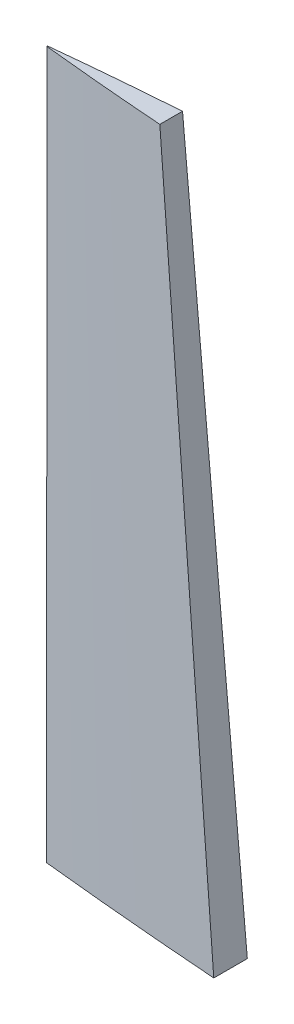
ISO-10303-21;
HEADER;
FILE_DESCRIPTION(('STEP AP214'),'2;1');
FILE_NAME('part.step','',(''),(''),'','','');
FILE_SCHEMA(('AUTOMOTIVE_DESIGN { 1 0 10303 214 1 1 1 1 }'));
ENDSEC;
DATA;
#1=APPLICATION_CONTEXT('core data for automotive mechanical design processes');
#2=APPLICATION_PROTOCOL_DEFINITION('international standard','automotive_design',2000,#1);
#3=PRODUCT_CONTEXT('',#1,'mechanical');
#4=PRODUCT('Part','Part','',(#3));
#5=PRODUCT_RELATED_PRODUCT_CATEGORY('part','',(#4));
#6=PRODUCT_DEFINITION_FORMATION('','',#4);
#7=PRODUCT_DEFINITION_CONTEXT('part definition',#1,'design');
#8=PRODUCT_DEFINITION('design','',#6,#7);
#9=PRODUCT_DEFINITION_SHAPE('','',#8);
#10=(LENGTH_UNIT() NAMED_UNIT(*) SI_UNIT(.MILLI.,.METRE.));
#11=(NAMED_UNIT(*) PLANE_ANGLE_UNIT() SI_UNIT($,.RADIAN.));
#12=(NAMED_UNIT(*) SI_UNIT($,.STERADIAN.) SOLID_ANGLE_UNIT());
#13=UNCERTAINTY_MEASURE_WITH_UNIT(LENGTH_MEASURE(1.E-05),#10,'distance_accuracy_value','');
#14=(GEOMETRIC_REPRESENTATION_CONTEXT(3) GLOBAL_UNCERTAINTY_ASSIGNED_CONTEXT((#13)) GLOBAL_UNIT_ASSIGNED_CONTEXT((#10,
#11,#12)) REPRESENTATION_CONTEXT('',''));
#15=CARTESIAN_POINT('',(0.,0.,0.));
#16=DIRECTION('',(0.,0.,1.));
#17=DIRECTION('',(1.,0.,0.));
#18=AXIS2_PLACEMENT_3D('',#15,#16,#17);
#19=CARTESIAN_POINT('',(-144.125629317277,199.605,-1.59685892477079));
#20=DIRECTION('',(0.,-1.,0.));
#21=DIRECTION('',(0.,0.,-1.));
#22=AXIS2_PLACEMENT_3D('',#19,#20,#21);
#23=PLANE('',#22);
#24=CARTESIAN_POINT('',(-128.54562,199.605,-2.8513546211547));
#25=CARTESIAN_POINT('',(-128.662159155722,199.605,-2.84313155852907));
#26=CARTESIAN_POINT('',(-130.392675736718,199.605,-2.72102542062161));
#27=CARTESIAN_POINT('',(-133.641298019005,199.605,-2.46944271971298));
#28=CARTESIAN_POINT('',(-138.180548644688,199.605,-2.10704311507215));
#29=CARTESIAN_POINT('',(-142.386624668814,199.605,-1.75120348476131));
#30=CARTESIAN_POINT('',(-146.21365688641,199.605,-1.41293799791403));
#31=CARTESIAN_POINT('',(-149.619660081276,199.605,-1.09929163754259));
#32=CARTESIAN_POINT('',(-152.567329870654,199.605,-0.817984838103686));
#33=CARTESIAN_POINT('',(-155.024372826058,199.605,-0.576148577125717));
#34=CARTESIAN_POINT('',(-156.963879738529,199.605,-0.380337828831559));
#35=CARTESIAN_POINT('',(-158.364609027917,199.605,-0.236101358977264));
#36=CARTESIAN_POINT('',(-159.211230866222,199.605,-0.147784134948368));
#37=CARTESIAN_POINT('',(-159.589234381624,199.605,-0.108047808459315));
#38=CARTESIAN_POINT('',(-159.684,199.605,-0.0980858969999983));
#39=B_SPLINE_CURVE_WITH_KNOTS('',3,(#24,#25,#26,#27,#28,#29,#30,#31,#32,#33,#34,#35,#36,#37,
#38),.UNSPECIFIED.,.F.,.F.,(4,1,1,1,1,1,1,1,1,1,1,1,4),(0.,0.0112115722778325,0.166483201337751,
0.312686160175411,0.448210552609216,0.571562715657406,0.681381362004342,0.776452466822885,
0.855722863352053,0.918312437422216,0.963524724344559,0.990855635167137,1.),.UNSPECIFIED.);
#40=CARTESIAN_POINT('',(-128.54562,199.605,-2.8513546211547));
#41=VERTEX_POINT('',#40);
#42=CARTESIAN_POINT('',(-159.684,199.605,-0.0980858969999983));
#43=VERTEX_POINT('',#42);
#44=EDGE_CURVE('E122',#41,#43,#39,.T.);
#45=ORIENTED_EDGE('',*,*,#44,.T.);
#46=DIRECTION('',(0.,0.,1.));
#47=VECTOR('',#46,1.);
#48=CARTESIAN_POINT('',(-159.684,199.605,-0.0980858969999983));
#49=LINE('',#48,#47);
#50=CARTESIAN_POINT('',(-159.684,199.605,0.0980858969999983));
#51=VERTEX_POINT('',#50);
#52=EDGE_CURVE('E254',#43,#51,#49,.T.);
#53=ORIENTED_EDGE('',*,*,#52,.T.);
#54=CARTESIAN_POINT('',(-159.684,199.605,0.0980858969999983));
#55=CARTESIAN_POINT('',(-159.589234381624,199.605,0.108047808459315));
#56=CARTESIAN_POINT('',(-159.211230866222,199.605,0.147784134948368));
#57=CARTESIAN_POINT('',(-158.364609027917,199.605,0.236101358977264));
#58=CARTESIAN_POINT('',(-156.963879738529,199.605,0.380337828831559));
#59=CARTESIAN_POINT('',(-155.024372826058,199.605,0.576148577125717));
#60=CARTESIAN_POINT('',(-152.567329870654,199.605,0.817984838103686));
#61=CARTESIAN_POINT('',(-149.619660081276,199.605,1.09929163754259));
#62=CARTESIAN_POINT('',(-146.21365688641,199.605,1.41293799791403));
#63=CARTESIAN_POINT('',(-142.386624668814,199.605,1.75120348476131));
#64=CARTESIAN_POINT('',(-138.180548644688,199.605,2.10704311507215));
#65=CARTESIAN_POINT('',(-133.641298019005,199.605,2.46944271971298));
#66=CARTESIAN_POINT('',(-130.392675736718,199.605,2.72102542062161));
#67=CARTESIAN_POINT('',(-128.662159155722,199.605,2.84313155852907));
#68=CARTESIAN_POINT('',(-128.54562,199.605,2.8513546211547));
#69=B_SPLINE_CURVE_WITH_KNOTS('',3,(#54,#55,#56,#57,#58,#59,#60,#61,#62,#63,#64,#65,#66,#67,
#68),.UNSPECIFIED.,.F.,.F.,(4,1,1,1,1,1,1,1,1,1,1,1,4),(0.,0.00914436483286341,
0.0364752756554408,0.0816875625777839,0.144277136647947,0.223547533177115,0.318618637995658,
0.428437284342594,0.551789447390784,0.687313839824589,0.833516798662249,0.988788427722167,1.),.UNSPECIFIED.);
#70=CARTESIAN_POINT('',(-128.54562,199.605,2.8513546211547));
#71=VERTEX_POINT('',#70);
#72=EDGE_CURVE('E79',#51,#71,#69,.T.);
#73=ORIENTED_EDGE('',*,*,#72,.T.);
#74=DIRECTION('',(0.,0.,-1.));
#75=VECTOR('',#74,1.);
#76=CARTESIAN_POINT('',(-128.54562,199.605,-2.8513546211547));
#77=LINE('',#76,#75);
#78=EDGE_CURVE('E12',#71,#41,#77,.T.);
#79=ORIENTED_EDGE('',*,*,#78,.T.);
#80=EDGE_LOOP('',(#45,#53,#73,#79));
#81=FACE_BOUND('',#80,.T.);
#82=ADVANCED_FACE('F69',(#81),#23,.F.);
#83=CARTESIAN_POINT('',(-136.671402998862,22.,-2.36193568419273));
#84=DIRECTION('',(0.,-1.,0.));
#85=DIRECTION('',(0.,0.,-1.));
#86=AXIS2_PLACEMENT_3D('',#83,#84,#85);
#87=PLANE('',#86);
#88=CARTESIAN_POINT('',(-113.6268,22.,-4.21747727587133));
#89=CARTESIAN_POINT('',(-113.799174645146,22.,-4.20531443246196));
#90=CARTESIAN_POINT('',(-116.358805180654,22.,-4.02470558849411));
#91=CARTESIAN_POINT('',(-121.163886439851,22.,-3.65258620488171));
#92=CARTESIAN_POINT('',(-127.877953578771,22.,-3.11655603661787));
#93=CARTESIAN_POINT('',(-134.099217647691,22.,-2.59022881531887));
#94=CARTESIAN_POINT('',(-139.759832883688,22.,-2.0898957478689));
#95=CARTESIAN_POINT('',(-144.797698384288,22.,-1.62597716415005));
#96=CARTESIAN_POINT('',(-149.157636731219,22.,-1.20989246343287));
#97=CARTESIAN_POINT('',(-152.79188227661,22.,-0.85218917125408));
#98=CARTESIAN_POINT('',(-155.660633244677,22.,-0.562562838852275));
#99=CARTESIAN_POINT('',(-157.732470926251,22.,-0.349220720881678));
#100=CARTESIAN_POINT('',(-158.984720764913,22.,-0.218589517506817));
#101=CARTESIAN_POINT('',(-159.543830889125,22.,-0.159814978292781));
#102=CARTESIAN_POINT('',(-159.684,22.,-0.145080179999997));
#103=B_SPLINE_CURVE_WITH_KNOTS('',3,(#88,#89,#90,#91,#92,#93,#94,#95,#96,#97,#98,#99,#100,#101,
#102),.UNSPECIFIED.,.F.,.F.,(4,1,1,1,1,1,1,1,1,1,1,1,4),(0.,0.011211572277832,0.166483201337751,
0.312686160175411,0.448210552609216,0.571562715657405,0.681381362004342,0.776452466822884,
0.855722863352052,0.918312437422216,0.963524724344559,0.990855635167136,1.),.UNSPECIFIED.);
#104=CARTESIAN_POINT('',(-113.6268,22.,-4.21747727587133));
#105=VERTEX_POINT('',#104);
#106=CARTESIAN_POINT('',(-159.684,22.,-0.145080179999997));
#107=VERTEX_POINT('',#106);
#108=EDGE_CURVE('E119',#105,#107,#103,.T.);
#109=ORIENTED_EDGE('',*,*,#108,.F.);
#110=DIRECTION('',(0.,0.,-1.));
#111=VECTOR('',#110,1.);
#112=CARTESIAN_POINT('',(-113.6268,22.,-4.21747727587133));
#113=LINE('',#112,#111);
#114=CARTESIAN_POINT('',(-113.6268,22.,4.21747727587133));
#115=VERTEX_POINT('',#114);
#116=EDGE_CURVE('E126',#115,#105,#113,.T.);
#117=ORIENTED_EDGE('',*,*,#116,.F.);
#118=CARTESIAN_POINT('',(-159.684,22.,0.145080179999997));
#119=CARTESIAN_POINT('',(-159.543830889125,22.,0.159814978292781));
#120=CARTESIAN_POINT('',(-158.984720764913,22.,0.218589517506817));
#121=CARTESIAN_POINT('',(-157.732470926251,22.,0.349220720881678));
#122=CARTESIAN_POINT('',(-155.660633244677,22.,0.562562838852275));
#123=CARTESIAN_POINT('',(-152.79188227661,22.,0.85218917125408));
#124=CARTESIAN_POINT('',(-149.157636731219,22.,1.20989246343287));
#125=CARTESIAN_POINT('',(-144.797698384288,22.,1.62597716415005));
#126=CARTESIAN_POINT('',(-139.759832883688,22.,2.0898957478689));
#127=CARTESIAN_POINT('',(-134.099217647691,22.,2.59022881531887));
#128=CARTESIAN_POINT('',(-127.877953578771,22.,3.11655603661787));
#129=CARTESIAN_POINT('',(-121.163886439851,22.,3.65258620488171));
#130=CARTESIAN_POINT('',(-116.358805180654,22.,4.02470558849411));
#131=CARTESIAN_POINT('',(-113.799174645146,22.,4.20531443246196));
#132=CARTESIAN_POINT('',(-113.6268,22.,4.21747727587133));
#133=B_SPLINE_CURVE_WITH_KNOTS('',3,(#118,#119,#120,#121,#122,#123,#124,#125,#126,#127,#128,
#129,#130,#131,#132),.UNSPECIFIED.,.F.,.F.,(4,1,1,1,1,1,1,1,1,1,1,1,4),(0.,0.00914436483286363,
0.0364752756554412,0.0816875625777842,0.144277136647948,0.223547533177116,0.318618637995658,
0.428437284342595,0.551789447390784,0.687313839824589,0.833516798662249,0.988788427722168,1.),.UNSPECIFIED.);
#134=CARTESIAN_POINT('',(-159.684,22.,0.145080179999997));
#135=VERTEX_POINT('',#134);
#136=EDGE_CURVE('E132',#135,#115,#133,.T.);
#137=ORIENTED_EDGE('',*,*,#136,.F.);
#138=DIRECTION('',(0.,0.,1.));
#139=VECTOR('',#138,1.);
#140=CARTESIAN_POINT('',(-159.684,22.,-0.145080179999997));
#141=LINE('',#140,#139);
#142=EDGE_CURVE('E138',#107,#135,#141,.T.);
#143=ORIENTED_EDGE('',*,*,#142,.F.);
#144=EDGE_LOOP('',(#109,#117,#137,#143));
#145=FACE_BOUND('',#144,.T.);
#146=ADVANCED_FACE('F136',(#145),#87,.T.);
#147=CARTESIAN_POINT('',(-113.6268,22.,-4.21747727587133));
#148=CARTESIAN_POINT('',(-128.54562,199.605,-2.8513546211547));
#149=CARTESIAN_POINT('',(-113.799174645146,22.,-4.20531443246196));
#150=CARTESIAN_POINT('',(-128.662159155722,199.605,-2.84313155852907));
#151=CARTESIAN_POINT('',(-116.358805180654,22.,-4.02470558849411));
#152=CARTESIAN_POINT('',(-130.392675736718,199.605,-2.72102542062161));
#153=CARTESIAN_POINT('',(-121.163886439851,22.,-3.65258620488171));
#154=CARTESIAN_POINT('',(-133.641298019005,199.605,-2.46944271971298));
#155=CARTESIAN_POINT('',(-127.877953578771,22.,-3.11655603661787));
#156=CARTESIAN_POINT('',(-138.180548644688,199.605,-2.10704311507215));
#157=CARTESIAN_POINT('',(-134.099217647691,22.,-2.59022881531887));
#158=CARTESIAN_POINT('',(-142.386624668814,199.605,-1.75120348476131));
#159=CARTESIAN_POINT('',(-139.759832883688,22.,-2.0898957478689));
#160=CARTESIAN_POINT('',(-146.21365688641,199.605,-1.41293799791403));
#161=CARTESIAN_POINT('',(-144.797698384288,22.,-1.62597716415005));
#162=CARTESIAN_POINT('',(-149.619660081276,199.605,-1.09929163754259));
#163=CARTESIAN_POINT('',(-149.157636731219,22.,-1.20989246343287));
#164=CARTESIAN_POINT('',(-152.567329870654,199.605,-0.817984838103686));
#165=CARTESIAN_POINT('',(-152.79188227661,22.,-0.85218917125408));
#166=CARTESIAN_POINT('',(-155.024372826058,199.605,-0.576148577125717));
#167=CARTESIAN_POINT('',(-155.660633244677,22.,-0.562562838852275));
#168=CARTESIAN_POINT('',(-156.963879738529,199.605,-0.380337828831559));
#169=CARTESIAN_POINT('',(-157.732470926251,22.,-0.349220720881678));
#170=CARTESIAN_POINT('',(-158.364609027917,199.605,-0.236101358977264));
#171=CARTESIAN_POINT('',(-158.984720764913,22.,-0.218589517506817));
#172=CARTESIAN_POINT('',(-159.211230866222,199.605,-0.147784134948368));
#173=CARTESIAN_POINT('',(-159.543830889125,22.,-0.159814978292781));
#174=CARTESIAN_POINT('',(-159.589234381624,199.605,-0.108047808459315));
#175=CARTESIAN_POINT('',(-159.684,22.,-0.145080179999997));
#176=CARTESIAN_POINT('',(-159.684,199.605,-0.0980858969999983));
#177=B_SPLINE_SURFACE_WITH_KNOTS('',3,1,((#147,#148),(#149,#150),(#151,#152),(#153,#154),(#155,
#156),(#157,#158),(#159,#160),(#161,#162),(#163,#164),(#165,#166),(#167,#168),(#169,#170),(#171,
#172),(#173,#174),(#175,#176)),.UNSPECIFIED.,.F.,.F.,.F.,(4,1,1,1,1,1,1,1,1,1,1,1,4),(2,2),(0.,
0.011211572277832,0.166483201337751,0.312686160175411,0.448210552609216,0.571562715657405,
0.681381362004342,0.776452466822884,0.855722863352052,0.918312437422216,0.963524724344559,
0.990855635167136,1.),(0.,1.),.UNSPECIFIED.);
#178=DIRECTION('',(0.,0.999999964993422,0.000264599990737255));
#179=VECTOR('',#178,1.);
#180=CARTESIAN_POINT('',(-159.684,110.8025,-0.121583038499998));
#181=LINE('',#180,#179);
#182=EDGE_CURVE('E125',#107,#43,#181,.T.);
#183=DIRECTION('',(0.0837027483550993,-0.99646128994166,-0.00766469605437604));
#184=VECTOR('',#183,1.);
#185=CARTESIAN_POINT('',(-121.08621,110.8025,-3.53441594851302));
#186=LINE('',#185,#184);
#187=EDGE_CURVE('E114',#41,#105,#186,.T.);
#188=ORIENTED_EDGE('',*,*,#108,.T.);
#189=ORIENTED_EDGE('',*,*,#182,.T.);
#190=ORIENTED_EDGE('',*,*,#44,.F.);
#191=ORIENTED_EDGE('',*,*,#187,.T.);
#192=EDGE_LOOP('',(#188,#189,#190,#191));
#193=FACE_BOUND('',#192,.T.);
#194=ADVANCED_FACE('F116',(#193),#177,.T.);
#195=CARTESIAN_POINT('',(-159.684,0.,0.));
#196=DIRECTION('',(1.,0.,0.));
#197=DIRECTION('',(0.,1.,0.));
#198=AXIS2_PLACEMENT_3D('',#195,#196,#197);
#199=PLANE('',#198);
#200=DIRECTION('',(0.,0.999999964993422,-0.000264599990737255));
#201=VECTOR('',#200,1.);
#202=CARTESIAN_POINT('',(-159.684,22.,0.145080179999997));
#203=LINE('',#202,#201);
#204=EDGE_CURVE('E272',#135,#51,#203,.T.);
#205=ORIENTED_EDGE('',*,*,#204,.T.);
#206=ORIENTED_EDGE('',*,*,#52,.F.);
#207=ORIENTED_EDGE('',*,*,#182,.F.);
#208=ORIENTED_EDGE('',*,*,#142,.T.);
#209=EDGE_LOOP('',(#205,#206,#207,#208));
#210=FACE_BOUND('',#209,.T.);
#211=ADVANCED_FACE('F257',(#210),#199,.F.);
#212=CARTESIAN_POINT('',(-110.995614940976,-9.32363165504201,0.));
#213=DIRECTION('',(-0.996490561068874,-0.0837052071297854,0.));
#214=DIRECTION('',(0.0837052071297854,-0.996490561068874,0.));
#215=AXIS2_PLACEMENT_3D('',#212,#213,#214);
#216=PLANE('',#215);
#217=ORIENTED_EDGE('',*,*,#187,.F.);
#218=ORIENTED_EDGE('',*,*,#78,.F.);
#219=DIRECTION('',(-0.0837027483550993,0.99646128994166,-0.00766469605437604));
#220=VECTOR('',#219,1.);
#221=CARTESIAN_POINT('',(-121.08621,110.8025,3.53441594851302));
#222=LINE('',#221,#220);
#223=EDGE_CURVE('E87',#115,#71,#222,.T.);
#224=ORIENTED_EDGE('',*,*,#223,.F.);
#225=ORIENTED_EDGE('',*,*,#116,.T.);
#226=EDGE_LOOP('',(#217,#218,#224,#225));
#227=FACE_BOUND('',#226,.T.);
#228=ADVANCED_FACE('F129',(#227),#216,.F.);
#229=CARTESIAN_POINT('',(-159.684,22.,0.145080179999997));
#230=CARTESIAN_POINT('',(-159.684,199.605,0.0980858969999983));
#231=CARTESIAN_POINT('',(-159.543830889125,22.,0.159814978292781));
#232=CARTESIAN_POINT('',(-159.589234381624,199.605,0.108047808459315));
#233=CARTESIAN_POINT('',(-158.984720764913,22.,0.218589517506817));
#234=CARTESIAN_POINT('',(-159.211230866222,199.605,0.147784134948368));
#235=CARTESIAN_POINT('',(-157.732470926251,22.,0.349220720881678));
#236=CARTESIAN_POINT('',(-158.364609027917,199.605,0.236101358977264));
#237=CARTESIAN_POINT('',(-155.660633244677,22.,0.562562838852275));
#238=CARTESIAN_POINT('',(-156.963879738529,199.605,0.380337828831559));
#239=CARTESIAN_POINT('',(-152.79188227661,22.,0.85218917125408));
#240=CARTESIAN_POINT('',(-155.024372826058,199.605,0.576148577125717));
#241=CARTESIAN_POINT('',(-149.157636731219,22.,1.20989246343287));
#242=CARTESIAN_POINT('',(-152.567329870654,199.605,0.817984838103686));
#243=CARTESIAN_POINT('',(-144.797698384288,22.,1.62597716415005));
#244=CARTESIAN_POINT('',(-149.619660081276,199.605,1.09929163754259));
#245=CARTESIAN_POINT('',(-139.759832883688,22.,2.0898957478689));
#246=CARTESIAN_POINT('',(-146.21365688641,199.605,1.41293799791403));
#247=CARTESIAN_POINT('',(-134.099217647691,22.,2.59022881531887));
#248=CARTESIAN_POINT('',(-142.386624668814,199.605,1.75120348476131));
#249=CARTESIAN_POINT('',(-127.877953578771,22.,3.11655603661787));
#250=CARTESIAN_POINT('',(-138.180548644688,199.605,2.10704311507215));
#251=CARTESIAN_POINT('',(-121.163886439851,22.,3.65258620488171));
#252=CARTESIAN_POINT('',(-133.641298019005,199.605,2.46944271971298));
#253=CARTESIAN_POINT('',(-116.358805180654,22.,4.02470558849411));
#254=CARTESIAN_POINT('',(-130.392675736718,199.605,2.72102542062161));
#255=CARTESIAN_POINT('',(-113.799174645146,22.,4.20531443246196));
#256=CARTESIAN_POINT('',(-128.662159155722,199.605,2.84313155852907));
#257=CARTESIAN_POINT('',(-113.6268,22.,4.21747727587133));
#258=CARTESIAN_POINT('',(-128.54562,199.605,2.8513546211547));
#259=B_SPLINE_SURFACE_WITH_KNOTS('',3,1,((#229,#230),(#231,#232),(#233,#234),(#235,#236),(#237,
#238),(#239,#240),(#241,#242),(#243,#244),(#245,#246),(#247,#248),(#249,#250),(#251,#252),(#253,
#254),(#255,#256),(#257,#258)),.UNSPECIFIED.,.F.,.F.,.F.,(4,1,1,1,1,1,1,1,1,1,1,1,4),(2,2),(0.,
0.00914436483286341,0.0364752756554412,0.0816875625777842,0.144277136647948,0.223547533177116,
0.318618637995658,0.428437284342595,0.551789447390784,0.687313839824589,0.833516798662249,
0.988788427722168,1.),(0.,1.),.UNSPECIFIED.);
#260=ORIENTED_EDGE('',*,*,#136,.T.);
#261=ORIENTED_EDGE('',*,*,#223,.T.);
#262=ORIENTED_EDGE('',*,*,#72,.F.);
#263=ORIENTED_EDGE('',*,*,#204,.F.);
#264=EDGE_LOOP('',(#260,#261,#262,#263));
#265=FACE_BOUND('',#264,.T.);
#266=ADVANCED_FACE('F205',(#265),#259,.T.);
#267=CLOSED_SHELL('',(#82,#146,#194,#211,#228,#266));
#268=MANIFOLD_SOLID_BREP('B2',#267);
#269=ADVANCED_BREP_SHAPE_REPRESENTATION('',(#18,#268),#14);
#270=SHAPE_DEFINITION_REPRESENTATION(#9,#269);
ENDSEC;
END-ISO-10303-21;
